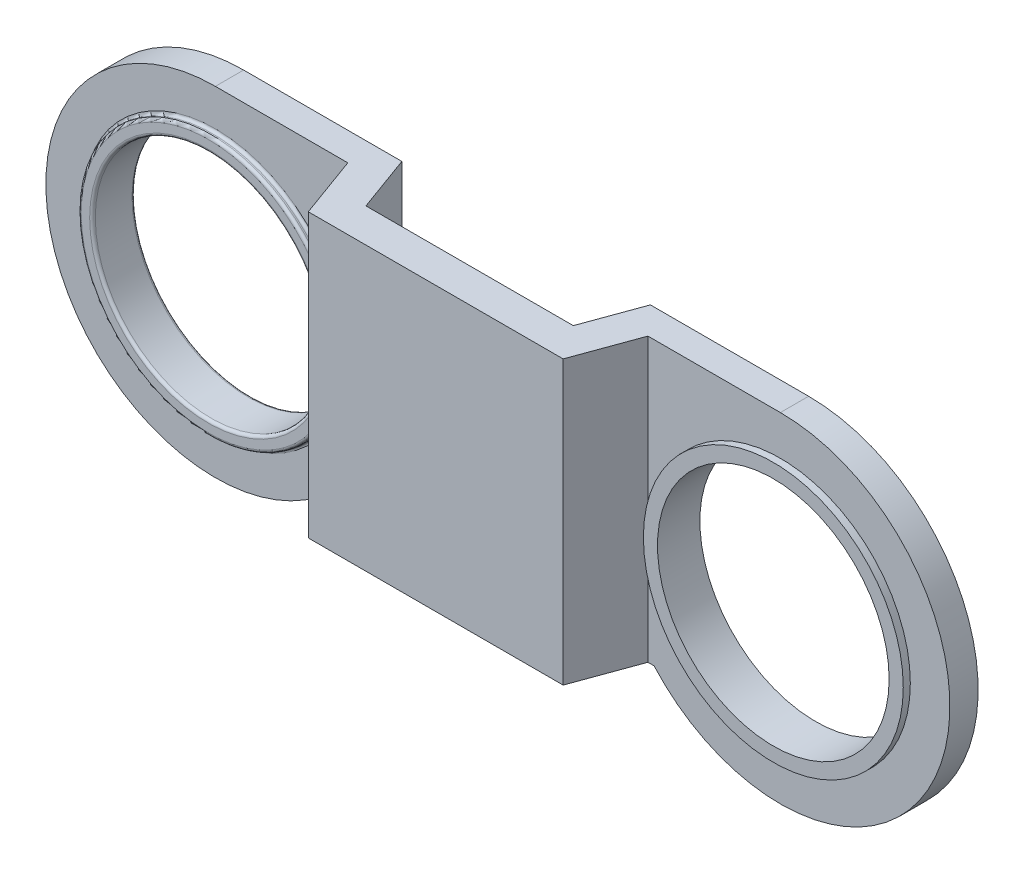
ISO-10303-21;
HEADER;
FILE_DESCRIPTION(('STEP AP214'),'2;1');
FILE_NAME('part.step','',(''),(''),'','','');
FILE_SCHEMA(('AUTOMOTIVE_DESIGN { 1 0 10303 214 1 1 1 1 }'));
ENDSEC;
DATA;
#1=APPLICATION_CONTEXT('core data for automotive mechanical design processes');
#2=APPLICATION_PROTOCOL_DEFINITION('international standard','automotive_design',2000,#1);
#3=PRODUCT_CONTEXT('',#1,'mechanical');
#4=PRODUCT('Part','Part','',(#3));
#5=PRODUCT_RELATED_PRODUCT_CATEGORY('part','',(#4));
#6=PRODUCT_DEFINITION_FORMATION('','',#4);
#7=PRODUCT_DEFINITION_CONTEXT('part definition',#1,'design');
#8=PRODUCT_DEFINITION('design','',#6,#7);
#9=PRODUCT_DEFINITION_SHAPE('','',#8);
#10=(LENGTH_UNIT() NAMED_UNIT(*) SI_UNIT(.MILLI.,.METRE.));
#11=(NAMED_UNIT(*) PLANE_ANGLE_UNIT() SI_UNIT($,.RADIAN.));
#12=(NAMED_UNIT(*) SI_UNIT($,.STERADIAN.) SOLID_ANGLE_UNIT());
#13=UNCERTAINTY_MEASURE_WITH_UNIT(LENGTH_MEASURE(1.E-05),#10,'distance_accuracy_value','');
#14=(GEOMETRIC_REPRESENTATION_CONTEXT(3) GLOBAL_UNCERTAINTY_ASSIGNED_CONTEXT((#13)) GLOBAL_UNIT_ASSIGNED_CONTEXT((#10,
#11,#12)) REPRESENTATION_CONTEXT('',''));
#15=CARTESIAN_POINT('',(0.,0.,0.));
#16=DIRECTION('',(0.,0.,1.));
#17=DIRECTION('',(1.,0.,0.));
#18=AXIS2_PLACEMENT_3D('',#15,#16,#17);
#19=CARTESIAN_POINT('',(-100.,0.,-20.));
#20=DIRECTION('',(0.,0.,1.));
#21=DIRECTION('',(1.,0.,0.));
#22=AXIS2_PLACEMENT_3D('',#19,#20,#21);
#23=PLANE('',#22);
#24=DIRECTION('',(1.,0.,0.));
#25=VECTOR('',#24,1.);
#26=CARTESIAN_POINT('',(-55.2786404500042,-40.,-20.));
#27=LINE('',#26,#25);
#28=CARTESIAN_POINT('',(43.9819142268074,-40.,-20.));
#29=VERTEX_POINT('',#28);
#30=CARTESIAN_POINT('',(55.2786404500042,-40.,-20.));
#31=VERTEX_POINT('',#30);
#32=EDGE_CURVE('E175',#29,#31,#27,.T.);
#33=ORIENTED_EDGE('',*,*,#32,.F.);
#34=DIRECTION('',(0.,1.,0.));
#35=VECTOR('',#34,1.);
#36=CARTESIAN_POINT('',(43.9819142268074,-102.,-20.));
#37=LINE('',#36,#35);
#38=CARTESIAN_POINT('',(43.9819142268074,60.,-20.));
#39=VERTEX_POINT('',#38);
#40=EDGE_CURVE('E291',#29,#39,#37,.T.);
#41=ORIENTED_EDGE('',*,*,#40,.T.);
#42=DIRECTION('',(-1.,0.,0.));
#43=VECTOR('',#42,1.);
#44=CARTESIAN_POINT('',(-100.,60.,-20.));
#45=LINE('',#44,#43);
#46=CARTESIAN_POINT('',(100.,60.,-20.));
#47=VERTEX_POINT('',#46);
#48=EDGE_CURVE('E182',#47,#39,#45,.T.);
#49=ORIENTED_EDGE('',*,*,#48,.F.);
#50=CARTESIAN_POINT('',(100.,0.,-20.));
#51=DIRECTION('',(0.,0.,1.));
#52=DIRECTION('',(1.,0.,0.));
#53=AXIS2_PLACEMENT_3D('',#50,#51,#52);
#54=CIRCLE('',#53,60.);
#55=EDGE_CURVE('E178',#31,#47,#54,.T.);
#56=ORIENTED_EDGE('',*,*,#55,.F.);
#57=EDGE_LOOP('',(#33,#41,#49,#56));
#58=FACE_BOUND('',#57,.T.);
#59=CARTESIAN_POINT('',(100.,0.,-20.));
#60=DIRECTION('',(0.,0.,1.));
#61=DIRECTION('',(1.,0.,0.));
#62=AXIS2_PLACEMENT_3D('',#59,#60,#61);
#63=CIRCLE('',#62,46.);
#64=CARTESIAN_POINT('',(146.,0.,-20.));
#65=VERTEX_POINT('',#64);
#66=EDGE_CURVE('E215',#65,#65,#63,.F.);
#67=ORIENTED_EDGE('',*,*,#66,.F.);
#68=EDGE_LOOP('',(#67));
#69=FACE_BOUND('',#68,.T.);
#70=ADVANCED_FACE('F38',(#58,#69),#23,.F.);
#71=CARTESIAN_POINT('',(160.,-102.,-10.));
#72=DIRECTION('',(0.,0.,-1.));
#73=DIRECTION('',(-1.,0.,0.));
#74=AXIS2_PLACEMENT_3D('',#71,#72,#73);
#75=PLANE('',#74);
#76=CARTESIAN_POINT('',(100.,0.,-10.));
#77=DIRECTION('',(0.,0.,-1.));
#78=DIRECTION('',(-1.,0.,0.));
#79=AXIS2_PLACEMENT_3D('',#76,#77,#78);
#80=CIRCLE('',#79,60.);
#81=CARTESIAN_POINT('',(100.,60.,-10.));
#82=VERTEX_POINT('',#81);
#83=CARTESIAN_POINT('',(55.2786404500042,-40.,-10.));
#84=VERTEX_POINT('',#83);
#85=EDGE_CURVE('E267',#82,#84,#80,.T.);
#86=ORIENTED_EDGE('',*,*,#85,.F.);
#87=DIRECTION('',(1.,0.,0.));
#88=VECTOR('',#87,1.);
#89=CARTESIAN_POINT('',(-100.,60.,-9.99999999999998));
#90=LINE('',#89,#88);
#91=CARTESIAN_POINT('',(53.1123451538564,60.,-10.));
#92=VERTEX_POINT('',#91);
#93=EDGE_CURVE('E144',#92,#82,#90,.T.);
#94=ORIENTED_EDGE('',*,*,#93,.F.);
#95=DIRECTION('',(0.,1.,0.));
#96=VECTOR('',#95,1.);
#97=CARTESIAN_POINT('',(53.1123451538564,-102.,-10.));
#98=LINE('',#97,#96);
#99=CARTESIAN_POINT('',(53.1123451538564,-40.,-10.));
#100=VERTEX_POINT('',#99);
#101=EDGE_CURVE('E259',#100,#92,#98,.T.);
#102=ORIENTED_EDGE('',*,*,#101,.F.);
#103=DIRECTION('',(-1.,0.,0.));
#104=VECTOR('',#103,1.);
#105=CARTESIAN_POINT('',(-55.2786404500042,-40.,-9.99999999999999));
#106=LINE('',#105,#104);
#107=EDGE_CURVE('E270',#84,#100,#106,.T.);
#108=ORIENTED_EDGE('',*,*,#107,.F.);
#109=EDGE_LOOP('',(#86,#94,#102,#108));
#110=FACE_BOUND('',#109,.T.);
#111=CARTESIAN_POINT('',(100.,0.,-10.));
#112=DIRECTION('',(0.,0.,-1.));
#113=DIRECTION('',(-1.,0.,0.));
#114=AXIS2_PLACEMENT_3D('',#111,#112,#113);
#115=CIRCLE('',#114,46.);
#116=CARTESIAN_POINT('',(54.,0.,-10.));
#117=VERTEX_POINT('',#116);
#118=EDGE_CURVE('E212',#117,#117,#115,.F.);
#119=ORIENTED_EDGE('',*,*,#118,.F.);
#120=EDGE_LOOP('',(#119));
#121=FACE_BOUND('',#120,.T.);
#122=ADVANCED_FACE('F278',(#110,#121),#75,.F.);
#123=CARTESIAN_POINT('',(-100.,0.,-20.));
#124=DIRECTION('',(0.,0.,1.));
#125=DIRECTION('',(1.,0.,0.));
#126=AXIS2_PLACEMENT_3D('',#123,#124,#125);
#127=CIRCLE('',#126,47.);
#128=CARTESIAN_POINT('',(-53.,0.,-20.));
#129=VERTEX_POINT('',#128);
#130=EDGE_CURVE('E222',#129,#129,#127,.T.);
#131=ORIENTED_EDGE('',*,*,#130,.T.);
#132=EDGE_LOOP('',(#131));
#133=FACE_BOUND('',#132,.T.);
#134=CARTESIAN_POINT('',(-43.9819142268074,60.,-20.));
#135=VERTEX_POINT('',#134);
#136=CARTESIAN_POINT('',(-100.,60.,-20.));
#137=VERTEX_POINT('',#136);
#138=EDGE_CURVE('E181',#135,#137,#45,.T.);
#139=ORIENTED_EDGE('',*,*,#138,.F.);
#140=DIRECTION('',(0.,1.,0.));
#141=VECTOR('',#140,1.);
#142=CARTESIAN_POINT('',(-43.9819142268074,-102.,-20.));
#143=LINE('',#142,#141);
#144=CARTESIAN_POINT('',(-43.9819142268074,-40.,-20.));
#145=VERTEX_POINT('',#144);
#146=EDGE_CURVE('E254',#145,#135,#143,.T.);
#147=ORIENTED_EDGE('',*,*,#146,.F.);
#148=CARTESIAN_POINT('',(-55.2786404500042,-40.,-20.));
#149=VERTEX_POINT('',#148);
#150=EDGE_CURVE('E176',#149,#145,#27,.T.);
#151=ORIENTED_EDGE('',*,*,#150,.F.);
#152=CARTESIAN_POINT('',(-100.,0.,-20.));
#153=DIRECTION('',(0.,0.,1.));
#154=DIRECTION('',(1.,0.,0.));
#155=AXIS2_PLACEMENT_3D('',#152,#153,#154);
#156=CIRCLE('',#155,60.);
#157=EDGE_CURVE('E172',#137,#149,#156,.T.);
#158=ORIENTED_EDGE('',*,*,#157,.F.);
#159=EDGE_LOOP('',(#139,#147,#151,#158));
#160=FACE_BOUND('',#159,.T.);
#161=ADVANCED_FACE('F349',(#133,#160),#23,.F.);
#162=CARTESIAN_POINT('',(-160.,-102.,-10.));
#163=DIRECTION('',(0.,0.,-1.));
#164=DIRECTION('',(-1.,0.,0.));
#165=AXIS2_PLACEMENT_3D('',#162,#163,#164);
#166=PLANE('',#165);
#167=DIRECTION('',(0.,1.,0.));
#168=VECTOR('',#167,1.);
#169=CARTESIAN_POINT('',(-53.1123451538564,-102.,-10.));
#170=LINE('',#169,#168);
#171=CARTESIAN_POINT('',(-53.1123451538564,-40.,-10.));
#172=VERTEX_POINT('',#171);
#173=CARTESIAN_POINT('',(-53.1123451538564,-3.24774121951012,-10.));
#174=VERTEX_POINT('',#173);
#175=EDGE_CURVE('E138',#172,#174,#170,.T.);
#176=ORIENTED_EDGE('',*,*,#175,.T.);
#177=CARTESIAN_POINT('',(-100.,0.,-10.));
#178=DIRECTION('',(0.,0.,-1.));
#179=DIRECTION('',(-1.,0.,0.));
#180=AXIS2_PLACEMENT_3D('',#177,#178,#179);
#181=CIRCLE('',#180,47.);
#182=CARTESIAN_POINT('',(-53.1123451538564,3.24774121951012,-10.));
#183=VERTEX_POINT('',#182);
#184=EDGE_CURVE('E52',#174,#183,#181,.T.);
#185=ORIENTED_EDGE('',*,*,#184,.T.);
#186=CARTESIAN_POINT('',(-53.1123451538564,60.,-10.));
#187=VERTEX_POINT('',#186);
#188=EDGE_CURVE('E151',#183,#187,#170,.T.);
#189=ORIENTED_EDGE('',*,*,#188,.T.);
#190=DIRECTION('',(1.,0.,0.));
#191=VECTOR('',#190,1.);
#192=CARTESIAN_POINT('',(-100.,60.,-10.));
#193=LINE('',#192,#191);
#194=CARTESIAN_POINT('',(-100.,60.,-10.));
#195=VERTEX_POINT('',#194);
#196=EDGE_CURVE('E150',#195,#187,#193,.T.);
#197=ORIENTED_EDGE('',*,*,#196,.F.);
#198=CARTESIAN_POINT('',(-100.,0.,-10.));
#199=DIRECTION('',(0.,0.,-1.));
#200=DIRECTION('',(-1.,0.,0.));
#201=AXIS2_PLACEMENT_3D('',#198,#199,#200);
#202=CIRCLE('',#201,60.);
#203=CARTESIAN_POINT('',(-55.2786404500042,-40.,-10.));
#204=VERTEX_POINT('',#203);
#205=EDGE_CURVE('E140',#204,#195,#202,.T.);
#206=ORIENTED_EDGE('',*,*,#205,.F.);
#207=DIRECTION('',(-1.,0.,0.));
#208=VECTOR('',#207,1.);
#209=CARTESIAN_POINT('',(-55.2786404500042,-40.,-10.));
#210=LINE('',#209,#208);
#211=EDGE_CURVE('E136',#172,#204,#210,.T.);
#212=ORIENTED_EDGE('',*,*,#211,.F.);
#213=EDGE_LOOP('',(#176,#185,#189,#197,#206,#212));
#214=FACE_BOUND('',#213,.T.);
#215=ADVANCED_FACE('F137',(#214),#166,.F.);
#216=CARTESIAN_POINT('',(-100.,0.,20.));
#217=DIRECTION('',(0.,0.,-1.));
#218=DIRECTION('',(-1.,0.,0.));
#219=AXIS2_PLACEMENT_3D('',#216,#217,#218);
#220=CYLINDRICAL_SURFACE('',#219,60.);
#221=ORIENTED_EDGE('',*,*,#205,.T.);
#222=DIRECTION('',(0.,0.,-1.));
#223=VECTOR('',#222,1.);
#224=CARTESIAN_POINT('',(-100.,60.,20.));
#225=LINE('',#224,#223);
#226=EDGE_CURVE('E185',#195,#137,#225,.T.);
#227=ORIENTED_EDGE('',*,*,#226,.T.);
#228=ORIENTED_EDGE('',*,*,#157,.T.);
#229=DIRECTION('',(0.,0.,-1.));
#230=VECTOR('',#229,1.);
#231=CARTESIAN_POINT('',(-55.2786404500042,-40.,20.));
#232=LINE('',#231,#230);
#233=EDGE_CURVE('E192',#204,#149,#232,.T.);
#234=ORIENTED_EDGE('',*,*,#233,.F.);
#235=EDGE_LOOP('',(#221,#227,#228,#234));
#236=FACE_BOUND('',#235,.T.);
#237=ADVANCED_FACE('F360',(#236),#220,.T.);
#238=CARTESIAN_POINT('',(-55.2786404500042,-40.,20.));
#239=DIRECTION('',(0.,1.,0.));
#240=DIRECTION('',(0.,0.,1.));
#241=AXIS2_PLACEMENT_3D('',#238,#239,#240);
#242=PLANE('',#241);
#243=ORIENTED_EDGE('',*,*,#150,.T.);
#244=DIRECTION('',(0.342020143325666,0.,0.939692620785909));
#245=VECTOR('',#244,1.);
#246=CARTESIAN_POINT('',(-32.4476279703169,-40.,11.6901910392337));
#247=LINE('',#246,#245);
#248=CARTESIAN_POINT('',(-36.7025095414835,-40.,0.));
#249=VERTEX_POINT('',#248);
#250=EDGE_CURVE('E169',#145,#249,#247,.T.);
#251=ORIENTED_EDGE('',*,*,#250,.T.);
#252=DIRECTION('',(1.,0.,0.));
#253=VECTOR('',#252,1.);
#254=CARTESIAN_POINT('',(-55.2786404500042,-40.,0.));
#255=LINE('',#254,#253);
#256=CARTESIAN_POINT('',(36.7025095414835,-40.,0.));
#257=VERTEX_POINT('',#256);
#258=EDGE_CURVE('E158',#249,#257,#255,.T.);
#259=ORIENTED_EDGE('',*,*,#258,.T.);
#260=DIRECTION('',(0.342020143325666,0.,-0.939692620785909));
#261=VECTOR('',#260,1.);
#262=CARTESIAN_POINT('',(19.5148828602106,-40.,47.2226162008133));
#263=LINE('',#262,#261);
#264=EDGE_CURVE('E161',#257,#29,#263,.T.);
#265=ORIENTED_EDGE('',*,*,#264,.T.);
#266=ORIENTED_EDGE('',*,*,#32,.T.);
#267=DIRECTION('',(0.,0.,-1.));
#268=VECTOR('',#267,1.);
#269=CARTESIAN_POINT('',(55.2786404500042,-40.,20.));
#270=LINE('',#269,#268);
#271=EDGE_CURVE('E189',#84,#31,#270,.T.);
#272=ORIENTED_EDGE('',*,*,#271,.F.);
#273=ORIENTED_EDGE('',*,*,#107,.T.);
#274=DIRECTION('',(-0.342020143325665,0.,0.93969262078591));
#275=VECTOR('',#274,1.);
#276=CARTESIAN_POINT('',(30.7911943096416,-40.,51.3268579207213));
#277=LINE('',#276,#275);
#278=CARTESIAN_POINT('',(45.105,-40.,12.));
#279=VERTEX_POINT('',#278);
#280=EDGE_CURVE('E163',#100,#279,#277,.T.);
#281=ORIENTED_EDGE('',*,*,#280,.T.);
#282=DIRECTION('',(-1.,0.,0.));
#283=VECTOR('',#282,1.);
#284=CARTESIAN_POINT('',(-55.2786404500042,-40.,12.));
#285=LINE('',#284,#283);
#286=CARTESIAN_POINT('',(-45.105,-40.,12.));
#287=VERTEX_POINT('',#286);
#288=EDGE_CURVE('E157',#279,#287,#285,.T.);
#289=ORIENTED_EDGE('',*,*,#288,.T.);
#290=DIRECTION('',(-0.342020143325666,0.,-0.939692620785909));
#291=VECTOR('',#290,1.);
#292=CARTESIAN_POINT('',(-43.7239394197479,-40.,15.7944327591417));
#293=LINE('',#292,#291);
#294=EDGE_CURVE('E148',#287,#172,#293,.T.);
#295=ORIENTED_EDGE('',*,*,#294,.T.);
#296=ORIENTED_EDGE('',*,*,#211,.T.);
#297=ORIENTED_EDGE('',*,*,#233,.T.);
#298=EDGE_LOOP('',(#243,#251,#259,#265,#266,#272,#273,#281,#289,#295,#296,#297));
#299=FACE_BOUND('',#298,.T.);
#300=ADVANCED_FACE('F155',(#299),#242,.F.);
#301=CARTESIAN_POINT('',(100.,0.,20.));
#302=DIRECTION('',(0.,0.,-1.));
#303=DIRECTION('',(-1.,0.,0.));
#304=AXIS2_PLACEMENT_3D('',#301,#302,#303);
#305=CYLINDRICAL_SURFACE('',#304,60.);
#306=DIRECTION('',(0.,0.,-1.));
#307=VECTOR('',#306,1.);
#308=CARTESIAN_POINT('',(100.,60.,20.));
#309=LINE('',#308,#307);
#310=EDGE_CURVE('E187',#82,#47,#309,.T.);
#311=ORIENTED_EDGE('',*,*,#310,.F.);
#312=ORIENTED_EDGE('',*,*,#85,.T.);
#313=ORIENTED_EDGE('',*,*,#271,.T.);
#314=ORIENTED_EDGE('',*,*,#55,.T.);
#315=EDGE_LOOP('',(#311,#312,#313,#314));
#316=FACE_BOUND('',#315,.T.);
#317=ADVANCED_FACE('F284',(#316),#305,.T.);
#318=CARTESIAN_POINT('',(-100.,60.,20.));
#319=DIRECTION('',(0.,-1.,0.));
#320=DIRECTION('',(1.,0.,0.));
#321=AXIS2_PLACEMENT_3D('',#318,#319,#320);
#322=PLANE('',#321);
#323=DIRECTION('',(-1.,0.,0.));
#324=VECTOR('',#323,1.);
#325=CARTESIAN_POINT('',(-100.,60.,0.));
#326=LINE('',#325,#324);
#327=CARTESIAN_POINT('',(36.7025095414835,60.,0.));
#328=VERTEX_POINT('',#327);
#329=CARTESIAN_POINT('',(-36.7025095414835,60.,0.));
#330=VERTEX_POINT('',#329);
#331=EDGE_CURVE('E203',#328,#330,#326,.T.);
#332=ORIENTED_EDGE('',*,*,#331,.T.);
#333=DIRECTION('',(-0.342020143325666,0.,-0.939692620785909));
#334=VECTOR('',#333,1.);
#335=CARTESIAN_POINT('',(-37.6790332593147,60.,-2.68297686430325));
#336=LINE('',#335,#334);
#337=EDGE_CURVE('E209',#330,#135,#336,.T.);
#338=ORIENTED_EDGE('',*,*,#337,.T.);
#339=ORIENTED_EDGE('',*,*,#138,.T.);
#340=ORIENTED_EDGE('',*,*,#226,.F.);
#341=ORIENTED_EDGE('',*,*,#196,.T.);
#342=DIRECTION('',(0.342020143325666,0.,0.939692620785909));
#343=VECTOR('',#342,1.);
#344=CARTESIAN_POINT('',(-48.9553447087456,60.,1.42126485560477));
#345=LINE('',#344,#343);
#346=CARTESIAN_POINT('',(-45.105,60.,12.));
#347=VERTEX_POINT('',#346);
#348=EDGE_CURVE('E200',#187,#347,#345,.T.);
#349=ORIENTED_EDGE('',*,*,#348,.T.);
#350=DIRECTION('',(1.,0.,0.));
#351=VECTOR('',#350,1.);
#352=CARTESIAN_POINT('',(-100.,60.,12.));
#353=LINE('',#352,#351);
#354=CARTESIAN_POINT('',(45.105,60.,12.));
#355=VERTEX_POINT('',#354);
#356=EDGE_CURVE('E197',#347,#355,#353,.T.);
#357=ORIENTED_EDGE('',*,*,#356,.T.);
#358=DIRECTION('',(0.342020143325665,0.,-0.93969262078591));
#359=VECTOR('',#358,1.);
#360=CARTESIAN_POINT('',(25.5597890206438,60.,65.7000258242582));
#361=LINE('',#360,#359);
#362=EDGE_CURVE('E194',#355,#92,#361,.T.);
#363=ORIENTED_EDGE('',*,*,#362,.T.);
#364=ORIENTED_EDGE('',*,*,#93,.T.);
#365=ORIENTED_EDGE('',*,*,#310,.T.);
#366=ORIENTED_EDGE('',*,*,#48,.T.);
#367=DIRECTION('',(-0.342020143325666,0.,0.939692620785909));
#368=VECTOR('',#367,1.);
#369=CARTESIAN_POINT('',(14.2834775712129,60.,61.5957841043503));
#370=LINE('',#369,#368);
#371=EDGE_CURVE('E206',#39,#328,#370,.T.);
#372=ORIENTED_EDGE('',*,*,#371,.T.);
#373=EDGE_LOOP('',(#332,#338,#339,#340,#341,#349,#357,#363,#364,#365,#366,#372));
#374=FACE_BOUND('',#373,.T.);
#375=ADVANCED_FACE('F282',(#374),#322,.F.);
#376=CARTESIAN_POINT('',(-45.105,-102.,12.));
#377=DIRECTION('',(0.939692620785909,0.,-0.342020143325666));
#378=DIRECTION('',(-0.342020143325666,0.,-0.939692620785909));
#379=AXIS2_PLACEMENT_3D('',#376,#377,#378);
#380=PLANE('',#379);
#381=ORIENTED_EDGE('',*,*,#188,.F.);
#382=CARTESIAN_POINT('',(-53.1123451538564,3.24774121951012,-10.));
#383=CARTESIAN_POINT('',(-53.1123245899119,2.91440566321166,-9.99994350102694));
#384=CARTESIAN_POINT('',(-53.1120620393758,2.58107179704119,-9.99922214935734));
#385=CARTESIAN_POINT('',(-53.1115711444614,2.08107214742676,-9.99787342666486));
#386=CARTESIAN_POINT('',(-53.111391334956,1.91440602105076,-9.9973794041089));
#387=CARTESIAN_POINT('',(-53.1110436776711,1.58107373730069,-9.9964242235691));
#388=CARTESIAN_POINT('',(-53.1108758298882,1.41440757992665,-9.99596306557567));
#389=CARTESIAN_POINT('',(-53.1103992081974,0.873119024524482,-9.99465355824236));
#390=CARTESIAN_POINT('',(-53.1101759090538,0.498495803702638,-9.99404004888767));
#391=CARTESIAN_POINT('',(-53.110099060671,-0.250751607145803,-9.99382890969111));
#392=CARTESIAN_POINT('',(-53.1102455119953,-0.625375797173006,-9.99423128139762));
#393=CARTESIAN_POINT('',(-53.1106658200992,-1.18731111179576,-9.99538606842243));
#394=CARTESIAN_POINT('',(-53.1108393617779,-1.37462303472722,-9.99586287026602));
#395=CARTESIAN_POINT('',(-53.1112152852891,-1.74924661162932,-9.99689571162444));
#396=CARTESIAN_POINT('',(-53.1114176671202,-1.93655826559997,-9.99745175113555));
#397=CARTESIAN_POINT('',(-53.1118020201986,-2.31118139679558,-9.99850775253937));
#398=CARTESIAN_POINT('',(-53.111983991491,-2.49849287402001,-9.99900771455638));
#399=CARTESIAN_POINT('',(-53.1122537022216,-2.87311650472873,-9.99974873869843));
#400=CARTESIAN_POINT('',(-53.1123414415846,-3.06042865821344,-9.99998980061723));
#401=CARTESIAN_POINT('',(-53.1123451538564,-3.24774121951012,-10.));
#402=B_SPLINE_CURVE_WITH_KNOTS('',3,(#382,#383,#384,#385,#386,#387,#388,#389,#390,#391,#392,
#393,#394,#395,#396,#397,#398,#399,#400,#401),.UNSPECIFIED.,.F.,.F.,(4,2,2,2,2,2,2,2,2,4),(0.,
1.00000442383684,1.50000524441401,2.00000591918684,3.1238760859654,4.24774796572631,
4.80968578438289,5.37162357670212,5.93356012336413,6.49549711766748),.UNSPECIFIED.);
#403=EDGE_CURVE('E11',#183,#174,#402,.T.);
#404=ORIENTED_EDGE('',*,*,#403,.T.);
#405=ORIENTED_EDGE('',*,*,#175,.F.);
#406=ORIENTED_EDGE('',*,*,#294,.F.);
#407=DIRECTION('',(0.,1.,0.));
#408=VECTOR('',#407,1.);
#409=CARTESIAN_POINT('',(-45.105,-102.,12.));
#410=LINE('',#409,#408);
#411=EDGE_CURVE('E250',#287,#347,#410,.T.);
#412=ORIENTED_EDGE('',*,*,#411,.T.);
#413=ORIENTED_EDGE('',*,*,#348,.F.);
#414=EDGE_LOOP('',(#381,#404,#405,#406,#412,#413));
#415=FACE_BOUND('',#414,.T.);
#416=ADVANCED_FACE('F146',(#415),#380,.F.);
#417=CARTESIAN_POINT('',(0.,-102.,12.));
#418=DIRECTION('',(0.,0.,-1.));
#419=DIRECTION('',(-1.,0.,0.));
#420=AXIS2_PLACEMENT_3D('',#417,#418,#419);
#421=PLANE('',#420);
#422=DIRECTION('',(0.,1.,0.));
#423=VECTOR('',#422,1.);
#424=CARTESIAN_POINT('',(45.105,-102.,12.));
#425=LINE('',#424,#423);
#426=EDGE_CURVE('E251',#279,#355,#425,.T.);
#427=ORIENTED_EDGE('',*,*,#426,.T.);
#428=ORIENTED_EDGE('',*,*,#356,.F.);
#429=ORIENTED_EDGE('',*,*,#411,.F.);
#430=ORIENTED_EDGE('',*,*,#288,.F.);
#431=EDGE_LOOP('',(#427,#428,#429,#430));
#432=FACE_BOUND('',#431,.T.);
#433=ADVANCED_FACE('F376',(#432),#421,.F.);
#434=CARTESIAN_POINT('',(45.105,-102.,12.));
#435=DIRECTION('',(-0.93969262078591,0.,-0.342020143325665));
#436=DIRECTION('',(-0.342020143325665,0.,0.93969262078591));
#437=AXIS2_PLACEMENT_3D('',#434,#435,#436);
#438=PLANE('',#437);
#439=ORIENTED_EDGE('',*,*,#101,.T.);
#440=ORIENTED_EDGE('',*,*,#362,.F.);
#441=ORIENTED_EDGE('',*,*,#426,.F.);
#442=ORIENTED_EDGE('',*,*,#280,.F.);
#443=EDGE_LOOP('',(#439,#440,#441,#442));
#444=FACE_BOUND('',#443,.T.);
#445=ADVANCED_FACE('F276',(#444),#438,.F.);
#446=CARTESIAN_POINT('',(-36.7025095414835,-102.,0.));
#447=DIRECTION('',(-0.939692620785909,0.,0.342020143325666));
#448=DIRECTION('',(0.342020143325666,0.,0.939692620785909));
#449=AXIS2_PLACEMENT_3D('',#446,#447,#448);
#450=PLANE('',#449);
#451=ORIENTED_EDGE('',*,*,#146,.T.);
#452=ORIENTED_EDGE('',*,*,#337,.F.);
#453=DIRECTION('',(0.,1.,0.));
#454=VECTOR('',#453,1.);
#455=CARTESIAN_POINT('',(-36.7025095414835,-102.,0.));
#456=LINE('',#455,#454);
#457=EDGE_CURVE('E262',#249,#330,#456,.T.);
#458=ORIENTED_EDGE('',*,*,#457,.F.);
#459=ORIENTED_EDGE('',*,*,#250,.F.);
#460=EDGE_LOOP('',(#451,#452,#458,#459));
#461=FACE_BOUND('',#460,.T.);
#462=ADVANCED_FACE('F373',(#461),#450,.F.);
#463=CARTESIAN_POINT('',(36.7025095414835,-102.,0.));
#464=DIRECTION('',(0.939692620785909,0.,0.342020143325666));
#465=DIRECTION('',(0.342020143325666,0.,-0.939692620785909));
#466=AXIS2_PLACEMENT_3D('',#463,#464,#465);
#467=PLANE('',#466);
#468=DIRECTION('',(0.,1.,0.));
#469=VECTOR('',#468,1.);
#470=CARTESIAN_POINT('',(36.7025095414835,-102.,0.));
#471=LINE('',#470,#469);
#472=EDGE_CURVE('E296',#257,#328,#471,.T.);
#473=ORIENTED_EDGE('',*,*,#472,.T.);
#474=ORIENTED_EDGE('',*,*,#371,.F.);
#475=ORIENTED_EDGE('',*,*,#40,.F.);
#476=ORIENTED_EDGE('',*,*,#264,.F.);
#477=EDGE_LOOP('',(#473,#474,#475,#476));
#478=FACE_BOUND('',#477,.T.);
#479=ADVANCED_FACE('F294',(#478),#467,.F.);
#480=CARTESIAN_POINT('',(0.,-102.,0.));
#481=DIRECTION('',(0.,0.,1.));
#482=DIRECTION('',(1.,0.,0.));
#483=AXIS2_PLACEMENT_3D('',#480,#481,#482);
#484=PLANE('',#483);
#485=ORIENTED_EDGE('',*,*,#457,.T.);
#486=ORIENTED_EDGE('',*,*,#331,.F.);
#487=ORIENTED_EDGE('',*,*,#472,.F.);
#488=ORIENTED_EDGE('',*,*,#258,.F.);
#489=EDGE_LOOP('',(#485,#486,#487,#488));
#490=FACE_BOUND('',#489,.T.);
#491=ADVANCED_FACE('F422',(#490),#484,.F.);
#492=CARTESIAN_POINT('',(-100.,0.,-22.5));
#493=DIRECTION('',(0.,0.,1.));
#494=DIRECTION('',(1.,0.,0.));
#495=AXIS2_PLACEMENT_3D('',#492,#493,#494);
#496=CYLINDRICAL_SURFACE('',#495,46.);
#497=CARTESIAN_POINT('',(-100.,0.,-8.5));
#498=DIRECTION('',(0.,0.,-1.));
#499=DIRECTION('',(-1.,0.,0.));
#500=AXIS2_PLACEMENT_3D('',#497,#498,#499);
#501=CIRCLE('',#500,46.);
#502=CARTESIAN_POINT('',(-146.,0.,-8.5));
#503=VERTEX_POINT('',#502);
#504=EDGE_CURVE('E246',#503,#503,#501,.T.);
#505=ORIENTED_EDGE('',*,*,#504,.T.);
#506=EDGE_LOOP('',(#505));
#507=FACE_BOUND('',#506,.T.);
#508=CARTESIAN_POINT('',(-100.,0.,-9.));
#509=DIRECTION('',(0.,0.,-1.));
#510=DIRECTION('',(-1.,0.,0.));
#511=AXIS2_PLACEMENT_3D('',#508,#509,#510);
#512=CIRCLE('',#511,46.);
#513=CARTESIAN_POINT('',(-146.,0.,-9.));
#514=VERTEX_POINT('',#513);
#515=EDGE_CURVE('E243',#514,#514,#512,.F.);
#516=ORIENTED_EDGE('',*,*,#515,.T.);
#517=EDGE_LOOP('',(#516));
#518=FACE_BOUND('',#517,.T.);
#519=ADVANCED_FACE('F399',(#507,#518),#496,.T.);
#520=CARTESIAN_POINT('',(-100.,0.,-7.5));
#521=DIRECTION('',(0.,0.,-1.));
#522=DIRECTION('',(-1.,0.,0.));
#523=AXIS2_PLACEMENT_3D('',#520,#521,#522);
#524=PLANE('',#523);
#525=CARTESIAN_POINT('',(-100.,0.,-7.5));
#526=DIRECTION('',(0.,0.,-1.));
#527=DIRECTION('',(-1.,0.,0.));
#528=AXIS2_PLACEMENT_3D('',#525,#526,#527);
#529=CIRCLE('',#528,42.);
#530=CARTESIAN_POINT('',(-142.,0.,-7.5));
#531=VERTEX_POINT('',#530);
#532=EDGE_CURVE('E240',#531,#531,#529,.T.);
#533=ORIENTED_EDGE('',*,*,#532,.T.);
#534=EDGE_LOOP('',(#533));
#535=FACE_BOUND('',#534,.T.);
#536=CARTESIAN_POINT('',(-100.,0.,-7.5));
#537=DIRECTION('',(0.,0.,-1.));
#538=DIRECTION('',(-1.,0.,0.));
#539=AXIS2_PLACEMENT_3D('',#536,#537,#538);
#540=CIRCLE('',#539,45.);
#541=CARTESIAN_POINT('',(-145.,0.,-7.5));
#542=VERTEX_POINT('',#541);
#543=EDGE_CURVE('E237',#542,#542,#540,.F.);
#544=ORIENTED_EDGE('',*,*,#543,.T.);
#545=EDGE_LOOP('',(#544));
#546=FACE_BOUND('',#545,.T.);
#547=ADVANCED_FACE('F390',(#535,#546),#524,.F.);
#548=CARTESIAN_POINT('',(-100.,0.,20.));
#549=DIRECTION('',(0.,0.,-1.));
#550=DIRECTION('',(-1.,0.,0.));
#551=AXIS2_PLACEMENT_3D('',#548,#549,#550);
#552=CYLINDRICAL_SURFACE('',#551,41.);
#553=CARTESIAN_POINT('',(-100.,0.,-21.5));
#554=DIRECTION('',(0.,0.,-1.));
#555=DIRECTION('',(-1.,0.,0.));
#556=AXIS2_PLACEMENT_3D('',#553,#554,#555);
#557=CIRCLE('',#556,41.);
#558=CARTESIAN_POINT('',(-141.,0.,-21.5));
#559=VERTEX_POINT('',#558);
#560=EDGE_CURVE('E234',#559,#559,#557,.T.);
#561=ORIENTED_EDGE('',*,*,#560,.T.);
#562=EDGE_LOOP('',(#561));
#563=FACE_BOUND('',#562,.T.);
#564=CARTESIAN_POINT('',(-100.,0.,-8.5));
#565=DIRECTION('',(0.,0.,-1.));
#566=DIRECTION('',(-1.,0.,0.));
#567=AXIS2_PLACEMENT_3D('',#564,#565,#566);
#568=CIRCLE('',#567,41.);
#569=CARTESIAN_POINT('',(-141.,0.,-8.5));
#570=VERTEX_POINT('',#569);
#571=EDGE_CURVE('E231',#570,#570,#568,.F.);
#572=ORIENTED_EDGE('',*,*,#571,.T.);
#573=EDGE_LOOP('',(#572));
#574=FACE_BOUND('',#573,.T.);
#575=ADVANCED_FACE('F387',(#563,#574),#552,.F.);
#576=CARTESIAN_POINT('',(-100.,0.,-21.));
#577=DIRECTION('',(0.,0.,1.));
#578=DIRECTION('',(1.,0.,0.));
#579=AXIS2_PLACEMENT_3D('',#576,#577,#578);
#580=CIRCLE('',#579,46.);
#581=CARTESIAN_POINT('',(-54.,0.,-21.));
#582=VERTEX_POINT('',#581);
#583=EDGE_CURVE('E219',#582,#582,#580,.F.);
#584=ORIENTED_EDGE('',*,*,#583,.T.);
#585=EDGE_LOOP('',(#584));
#586=FACE_BOUND('',#585,.T.);
#587=CARTESIAN_POINT('',(-100.,0.,-21.5));
#588=DIRECTION('',(0.,0.,-1.));
#589=DIRECTION('',(-1.,0.,0.));
#590=AXIS2_PLACEMENT_3D('',#587,#588,#589);
#591=CIRCLE('',#590,46.);
#592=CARTESIAN_POINT('',(-146.,0.,-21.5));
#593=VERTEX_POINT('',#592);
#594=EDGE_CURVE('E216',#593,#593,#591,.F.);
#595=ORIENTED_EDGE('',*,*,#594,.T.);
#596=EDGE_LOOP('',(#595));
#597=FACE_BOUND('',#596,.T.);
#598=ADVANCED_FACE('F389',(#586,#597),#496,.T.);
#599=CARTESIAN_POINT('',(-100.,0.,-22.5));
#600=DIRECTION('',(0.,0.,-1.));
#601=DIRECTION('',(-1.,0.,0.));
#602=AXIS2_PLACEMENT_3D('',#599,#600,#601);
#603=PLANE('',#602);
#604=CARTESIAN_POINT('',(-100.,0.,-22.5));
#605=DIRECTION('',(0.,0.,-1.));
#606=DIRECTION('',(-1.,0.,0.));
#607=AXIS2_PLACEMENT_3D('',#604,#605,#606);
#608=CIRCLE('',#607,45.);
#609=CARTESIAN_POINT('',(-145.,0.,-22.5));
#610=VERTEX_POINT('',#609);
#611=EDGE_CURVE('E228',#610,#610,#608,.T.);
#612=ORIENTED_EDGE('',*,*,#611,.T.);
#613=EDGE_LOOP('',(#612));
#614=FACE_BOUND('',#613,.T.);
#615=CARTESIAN_POINT('',(-100.,0.,-22.5));
#616=DIRECTION('',(0.,0.,-1.));
#617=DIRECTION('',(-1.,0.,0.));
#618=AXIS2_PLACEMENT_3D('',#615,#616,#617);
#619=CIRCLE('',#618,42.);
#620=CARTESIAN_POINT('',(-142.,0.,-22.5));
#621=VERTEX_POINT('',#620);
#622=EDGE_CURVE('E225',#621,#621,#619,.F.);
#623=ORIENTED_EDGE('',*,*,#622,.T.);
#624=EDGE_LOOP('',(#623));
#625=FACE_BOUND('',#624,.T.);
#626=ADVANCED_FACE('F396',(#614,#625),#603,.T.);
#627=CARTESIAN_POINT('',(100.,0.,-22.5));
#628=DIRECTION('',(0.,0.,1.));
#629=DIRECTION('',(1.,0.,0.));
#630=AXIS2_PLACEMENT_3D('',#627,#628,#629);
#631=CYLINDRICAL_SURFACE('',#630,46.);
#632=CARTESIAN_POINT('',(100.,0.,-7.5));
#633=DIRECTION('',(0.,0.,-1.));
#634=DIRECTION('',(1.,0.,0.));
#635=AXIS2_PLACEMENT_3D('',#632,#633,#634);
#636=CIRCLE('',#635,46.);
#637=CARTESIAN_POINT('',(146.,0.,-7.5));
#638=VERTEX_POINT('',#637);
#639=EDGE_CURVE('E307',#638,#638,#636,.T.);
#640=ORIENTED_EDGE('',*,*,#639,.T.);
#641=EDGE_LOOP('',(#640));
#642=FACE_BOUND('',#641,.T.);
#643=ORIENTED_EDGE('',*,*,#118,.T.);
#644=EDGE_LOOP('',(#643));
#645=FACE_BOUND('',#644,.T.);
#646=ADVANCED_FACE('F316',(#642,#645),#631,.T.);
#647=CARTESIAN_POINT('',(100.,0.,-7.5));
#648=DIRECTION('',(0.,0.,1.));
#649=DIRECTION('',(1.,0.,0.));
#650=AXIS2_PLACEMENT_3D('',#647,#648,#649);
#651=PLANE('',#650);
#652=ORIENTED_EDGE('',*,*,#639,.F.);
#653=EDGE_LOOP('',(#652));
#654=FACE_BOUND('',#653,.T.);
#655=CARTESIAN_POINT('',(100.,0.,-7.5));
#656=DIRECTION('',(0.,0.,-1.));
#657=DIRECTION('',(1.,0.,0.));
#658=AXIS2_PLACEMENT_3D('',#655,#656,#657);
#659=CIRCLE('',#658,41.);
#660=CARTESIAN_POINT('',(141.,0.,-7.5));
#661=VERTEX_POINT('',#660);
#662=EDGE_CURVE('E306',#661,#661,#659,.T.);
#663=ORIENTED_EDGE('',*,*,#662,.T.);
#664=EDGE_LOOP('',(#663));
#665=FACE_BOUND('',#664,.T.);
#666=ADVANCED_FACE('F319',(#654,#665),#651,.T.);
#667=CARTESIAN_POINT('',(100.,0.,20.));
#668=DIRECTION('',(0.,0.,-1.));
#669=DIRECTION('',(-1.,0.,0.));
#670=AXIS2_PLACEMENT_3D('',#667,#668,#669);
#671=CYLINDRICAL_SURFACE('',#670,41.);
#672=ORIENTED_EDGE('',*,*,#662,.F.);
#673=EDGE_LOOP('',(#672));
#674=FACE_BOUND('',#673,.T.);
#675=CARTESIAN_POINT('',(100.,0.,-22.5));
#676=DIRECTION('',(0.,0.,-1.));
#677=DIRECTION('',(1.,0.,0.));
#678=AXIS2_PLACEMENT_3D('',#675,#676,#677);
#679=CIRCLE('',#678,41.);
#680=CARTESIAN_POINT('',(141.,0.,-22.5));
#681=VERTEX_POINT('',#680);
#682=EDGE_CURVE('E303',#681,#681,#679,.T.);
#683=ORIENTED_EDGE('',*,*,#682,.T.);
#684=EDGE_LOOP('',(#683));
#685=FACE_BOUND('',#684,.T.);
#686=ADVANCED_FACE('F322',(#674,#685),#671,.F.);
#687=CARTESIAN_POINT('',(100.,0.,-22.5));
#688=DIRECTION('',(0.,0.,-1.));
#689=DIRECTION('',(1.,0.,0.));
#690=AXIS2_PLACEMENT_3D('',#687,#688,#689);
#691=CIRCLE('',#690,46.);
#692=CARTESIAN_POINT('',(146.,0.,-22.5));
#693=VERTEX_POINT('',#692);
#694=EDGE_CURVE('E310',#693,#693,#691,.T.);
#695=ORIENTED_EDGE('',*,*,#694,.F.);
#696=EDGE_LOOP('',(#695));
#697=FACE_BOUND('',#696,.T.);
#698=ORIENTED_EDGE('',*,*,#66,.T.);
#699=EDGE_LOOP('',(#698));
#700=FACE_BOUND('',#699,.T.);
#701=ADVANCED_FACE('F328',(#697,#700),#631,.T.);
#702=CARTESIAN_POINT('',(100.,0.,-22.5));
#703=DIRECTION('',(0.,0.,1.));
#704=DIRECTION('',(1.,0.,0.));
#705=AXIS2_PLACEMENT_3D('',#702,#703,#704);
#706=PLANE('',#705);
#707=ORIENTED_EDGE('',*,*,#694,.T.);
#708=EDGE_LOOP('',(#707));
#709=FACE_BOUND('',#708,.T.);
#710=ORIENTED_EDGE('',*,*,#682,.F.);
#711=EDGE_LOOP('',(#710));
#712=FACE_BOUND('',#711,.T.);
#713=ADVANCED_FACE('F332',(#709,#712),#706,.F.);
#714=CARTESIAN_POINT('',(-100.,0.,-21.));
#715=DIRECTION('',(0.,0.,1.));
#716=DIRECTION('',(1.,0.,0.));
#717=AXIS2_PLACEMENT_3D('',#714,#715,#716);
#718=TOROIDAL_SURFACE('',#717,47.,1.);
#719=ORIENTED_EDGE('',*,*,#130,.F.);
#720=EDGE_LOOP('',(#719));
#721=FACE_BOUND('',#720,.T.);
#722=ORIENTED_EDGE('',*,*,#583,.F.);
#723=EDGE_LOOP('',(#722));
#724=FACE_BOUND('',#723,.T.);
#725=ADVANCED_FACE('F334',(#721,#724),#718,.F.);
#726=CARTESIAN_POINT('',(-100.,0.,-21.5));
#727=DIRECTION('',(0.,0.,-1.));
#728=DIRECTION('',(-1.,0.,0.));
#729=AXIS2_PLACEMENT_3D('',#726,#727,#728);
#730=TOROIDAL_SURFACE('',#729,45.,1.);
#731=ORIENTED_EDGE('',*,*,#594,.F.);
#732=EDGE_LOOP('',(#731));
#733=FACE_BOUND('',#732,.T.);
#734=ORIENTED_EDGE('',*,*,#611,.F.);
#735=EDGE_LOOP('',(#734));
#736=FACE_BOUND('',#735,.T.);
#737=ADVANCED_FACE('F341',(#733,#736),#730,.T.);
#738=CARTESIAN_POINT('',(-100.,0.,-21.5));
#739=DIRECTION('',(0.,0.,-1.));
#740=DIRECTION('',(-1.,0.,0.));
#741=AXIS2_PLACEMENT_3D('',#738,#739,#740);
#742=TOROIDAL_SURFACE('',#741,42.,1.);
#743=ORIENTED_EDGE('',*,*,#622,.F.);
#744=EDGE_LOOP('',(#743));
#745=FACE_BOUND('',#744,.T.);
#746=ORIENTED_EDGE('',*,*,#560,.F.);
#747=EDGE_LOOP('',(#746));
#748=FACE_BOUND('',#747,.T.);
#749=ADVANCED_FACE('F410',(#745,#748),#742,.T.);
#750=CARTESIAN_POINT('',(-100.,0.,-8.5));
#751=DIRECTION('',(0.,0.,-1.));
#752=DIRECTION('',(-1.,0.,0.));
#753=AXIS2_PLACEMENT_3D('',#750,#751,#752);
#754=TOROIDAL_SURFACE('',#753,42.,1.);
#755=ORIENTED_EDGE('',*,*,#571,.F.);
#756=EDGE_LOOP('',(#755));
#757=FACE_BOUND('',#756,.T.);
#758=ORIENTED_EDGE('',*,*,#532,.F.);
#759=EDGE_LOOP('',(#758));
#760=FACE_BOUND('',#759,.T.);
#761=ADVANCED_FACE('F406',(#757,#760),#754,.T.);
#762=CARTESIAN_POINT('',(-100.,0.,-8.5));
#763=DIRECTION('',(0.,0.,-1.));
#764=DIRECTION('',(-1.,0.,0.));
#765=AXIS2_PLACEMENT_3D('',#762,#763,#764);
#766=TOROIDAL_SURFACE('',#765,45.,1.);
#767=ORIENTED_EDGE('',*,*,#543,.F.);
#768=EDGE_LOOP('',(#767));
#769=FACE_BOUND('',#768,.T.);
#770=ORIENTED_EDGE('',*,*,#504,.F.);
#771=EDGE_LOOP('',(#770));
#772=FACE_BOUND('',#771,.T.);
#773=ADVANCED_FACE('F409',(#769,#772),#766,.T.);
#774=CARTESIAN_POINT('',(-100.,0.,-9.));
#775=DIRECTION('',(0.,0.,-1.));
#776=DIRECTION('',(-1.,0.,0.));
#777=AXIS2_PLACEMENT_3D('',#774,#775,#776);
#778=TOROIDAL_SURFACE('',#777,47.,1.);
#779=ORIENTED_EDGE('',*,*,#403,.F.);
#780=ORIENTED_EDGE('',*,*,#184,.F.);
#781=EDGE_LOOP('',(#779,#780));
#782=FACE_BOUND('',#781,.T.);
#783=ORIENTED_EDGE('',*,*,#515,.F.);
#784=EDGE_LOOP('',(#783));
#785=FACE_BOUND('',#784,.T.);
#786=ADVANCED_FACE('F40',(#782,#785),#778,.F.);
#787=CLOSED_SHELL('',(#70,#122,#161,#215,#237,#300,#317,#375,#416,#433,#445,#462,#479,#491,#519,
#547,#575,#598,#626,#646,#666,#686,#701,#713,#725,#737,#749,#761,#773,#786));
#788=MANIFOLD_SOLID_BREP('B2',#787);
#789=ADVANCED_BREP_SHAPE_REPRESENTATION('',(#18,#788),#14);
#790=SHAPE_DEFINITION_REPRESENTATION(#9,#789);
ENDSEC;
END-ISO-10303-21;
